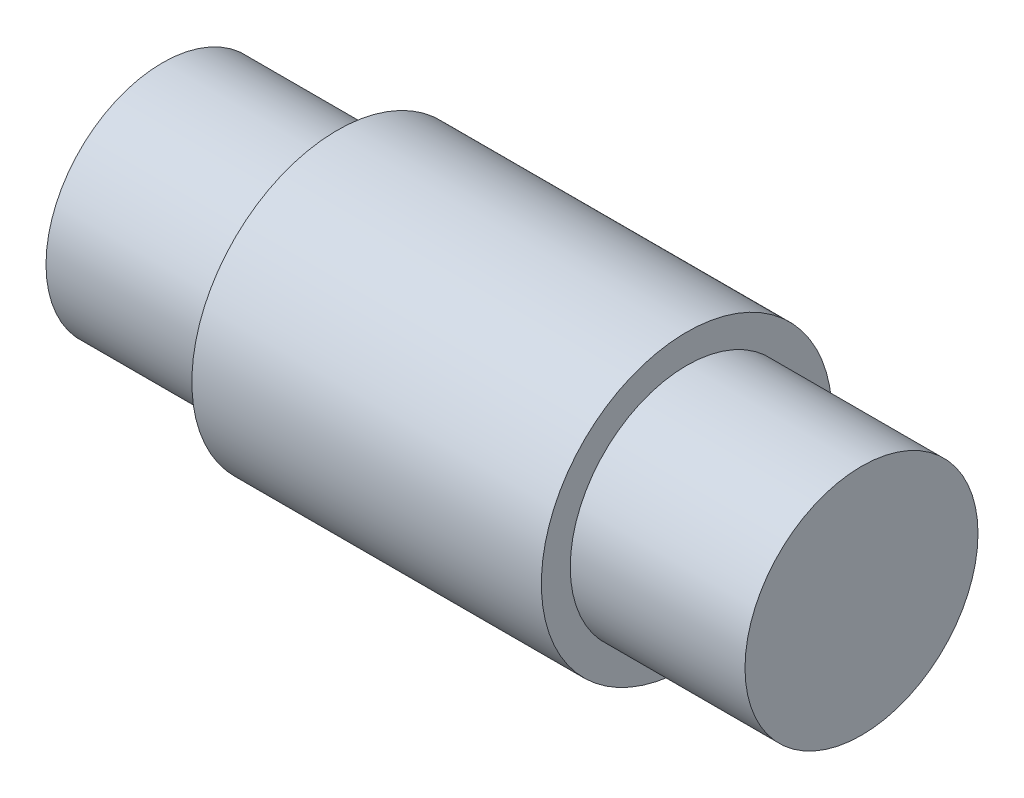
ISO-10303-21;
HEADER;
FILE_DESCRIPTION(('STEP AP214'),'2;1');
FILE_NAME('part.step','',(''),(''),'','','');
FILE_SCHEMA(('AUTOMOTIVE_DESIGN { 1 0 10303 214 1 1 1 1 }'));
ENDSEC;
DATA;
#1=APPLICATION_CONTEXT('core data for automotive mechanical design processes');
#2=APPLICATION_PROTOCOL_DEFINITION('international standard','automotive_design',2000,#1);
#3=PRODUCT_CONTEXT('',#1,'mechanical');
#4=PRODUCT('Part','Part','',(#3));
#5=PRODUCT_RELATED_PRODUCT_CATEGORY('part','',(#4));
#6=PRODUCT_DEFINITION_FORMATION('','',#4);
#7=PRODUCT_DEFINITION_CONTEXT('part definition',#1,'design');
#8=PRODUCT_DEFINITION('design','',#6,#7);
#9=PRODUCT_DEFINITION_SHAPE('','',#8);
#10=(LENGTH_UNIT() NAMED_UNIT(*) SI_UNIT(.MILLI.,.METRE.));
#11=(NAMED_UNIT(*) PLANE_ANGLE_UNIT() SI_UNIT($,.RADIAN.));
#12=(NAMED_UNIT(*) SI_UNIT($,.STERADIAN.) SOLID_ANGLE_UNIT());
#13=UNCERTAINTY_MEASURE_WITH_UNIT(LENGTH_MEASURE(1.E-05),#10,'distance_accuracy_value','');
#14=(GEOMETRIC_REPRESENTATION_CONTEXT(3) GLOBAL_UNCERTAINTY_ASSIGNED_CONTEXT((#13)) GLOBAL_UNIT_ASSIGNED_CONTEXT((#10,
#11,#12)) REPRESENTATION_CONTEXT('',''));
#15=CARTESIAN_POINT('',(0.,0.,0.));
#16=DIRECTION('',(0.,0.,1.));
#17=DIRECTION('',(1.,0.,0.));
#18=AXIS2_PLACEMENT_3D('',#15,#16,#17);
#19=CARTESIAN_POINT('',(9.525,0.,0.));
#20=DIRECTION('',(1.,0.,0.));
#21=DIRECTION('',(0.,0.,-1.));
#22=AXIS2_PLACEMENT_3D('',#19,#20,#21);
#23=PLANE('',#22);
#24=CARTESIAN_POINT('',(9.525,0.,0.));
#25=DIRECTION('',(1.,0.,0.));
#26=DIRECTION('',(0.,0.,-1.));
#27=AXIS2_PLACEMENT_3D('',#24,#25,#26);
#28=CIRCLE('',#27,3.175);
#29=CARTESIAN_POINT('',(9.525,0.,-3.175));
#30=VERTEX_POINT('',#29);
#31=EDGE_CURVE('E10',#30,#30,#28,.T.);
#32=ORIENTED_EDGE('',*,*,#31,.T.);
#33=EDGE_LOOP('',(#32));
#34=FACE_BOUND('',#33,.T.);
#35=ADVANCED_FACE('F36',(#34),#23,.T.);
#36=CARTESIAN_POINT('',(0.,0.,0.));
#37=DIRECTION('',(1.,0.,0.));
#38=DIRECTION('',(0.,0.,-1.));
#39=AXIS2_PLACEMENT_3D('',#36,#37,#38);
#40=CYLINDRICAL_SURFACE('',#39,3.175);
#41=ORIENTED_EDGE('',*,*,#31,.F.);
#42=EDGE_LOOP('',(#41));
#43=FACE_BOUND('',#42,.T.);
#44=CARTESIAN_POINT('',(4.7625,0.,0.));
#45=DIRECTION('',(1.,0.,0.));
#46=DIRECTION('',(0.,0.,-1.));
#47=AXIS2_PLACEMENT_3D('',#44,#45,#46);
#48=CIRCLE('',#47,3.175);
#49=CARTESIAN_POINT('',(4.7625,0.,-3.175));
#50=VERTEX_POINT('',#49);
#51=EDGE_CURVE('E42',#50,#50,#48,.T.);
#52=ORIENTED_EDGE('',*,*,#51,.T.);
#53=EDGE_LOOP('',(#52));
#54=FACE_BOUND('',#53,.T.);
#55=ADVANCED_FACE('F74',(#43,#54),#40,.T.);
#56=CARTESIAN_POINT('',(4.7625,0.,0.));
#57=DIRECTION('',(1.,0.,0.));
#58=DIRECTION('',(0.,0.,-1.));
#59=AXIS2_PLACEMENT_3D('',#56,#57,#58);
#60=PLANE('',#59);
#61=CARTESIAN_POINT('',(4.7625,0.,0.));
#62=DIRECTION('',(1.,0.,0.));
#63=DIRECTION('',(0.,0.,-1.));
#64=AXIS2_PLACEMENT_3D('',#61,#62,#63);
#65=CIRCLE('',#64,3.9624);
#66=CARTESIAN_POINT('',(4.7625,0.,-3.9624));
#67=VERTEX_POINT('',#66);
#68=EDGE_CURVE('E46',#67,#67,#65,.T.);
#69=ORIENTED_EDGE('',*,*,#68,.T.);
#70=EDGE_LOOP('',(#69));
#71=FACE_BOUND('',#70,.T.);
#72=ORIENTED_EDGE('',*,*,#51,.F.);
#73=EDGE_LOOP('',(#72));
#74=FACE_BOUND('',#73,.T.);
#75=ADVANCED_FACE('F78',(#71,#74),#60,.T.);
#76=CARTESIAN_POINT('',(0.,0.,0.));
#77=DIRECTION('',(1.,0.,0.));
#78=DIRECTION('',(0.,0.,-1.));
#79=AXIS2_PLACEMENT_3D('',#76,#77,#78);
#80=CYLINDRICAL_SURFACE('',#79,3.9624);
#81=ORIENTED_EDGE('',*,*,#68,.F.);
#82=EDGE_LOOP('',(#81));
#83=FACE_BOUND('',#82,.T.);
#84=CARTESIAN_POINT('',(-4.7625,0.,0.));
#85=DIRECTION('',(1.,0.,0.));
#86=DIRECTION('',(0.,0.,-1.));
#87=AXIS2_PLACEMENT_3D('',#84,#85,#86);
#88=CIRCLE('',#87,3.9624);
#89=CARTESIAN_POINT('',(-4.7625,0.,-3.9624));
#90=VERTEX_POINT('',#89);
#91=EDGE_CURVE('E50',#90,#90,#88,.T.);
#92=ORIENTED_EDGE('',*,*,#91,.T.);
#93=EDGE_LOOP('',(#92));
#94=FACE_BOUND('',#93,.T.);
#95=ADVANCED_FACE('F83',(#83,#94),#80,.T.);
#96=CARTESIAN_POINT('',(-4.7625,0.,0.));
#97=DIRECTION('',(1.,0.,0.));
#98=DIRECTION('',(0.,0.,-1.));
#99=AXIS2_PLACEMENT_3D('',#96,#97,#98);
#100=PLANE('',#99);
#101=ORIENTED_EDGE('',*,*,#91,.F.);
#102=EDGE_LOOP('',(#101));
#103=FACE_BOUND('',#102,.T.);
#104=CARTESIAN_POINT('',(-4.7625,0.,0.));
#105=DIRECTION('',(1.,0.,0.));
#106=DIRECTION('',(0.,0.,-1.));
#107=AXIS2_PLACEMENT_3D('',#104,#105,#106);
#108=CIRCLE('',#107,3.175);
#109=CARTESIAN_POINT('',(-4.7625,0.,-3.175));
#110=VERTEX_POINT('',#109);
#111=EDGE_CURVE('E55',#110,#110,#108,.T.);
#112=ORIENTED_EDGE('',*,*,#111,.T.);
#113=EDGE_LOOP('',(#112));
#114=FACE_BOUND('',#113,.T.);
#115=ADVANCED_FACE('F71',(#103,#114),#100,.F.);
#116=CARTESIAN_POINT('',(0.,0.,0.));
#117=DIRECTION('',(1.,0.,0.));
#118=DIRECTION('',(0.,0.,-1.));
#119=AXIS2_PLACEMENT_3D('',#116,#117,#118);
#120=CYLINDRICAL_SURFACE('',#119,3.175);
#121=CARTESIAN_POINT('',(-9.525,0.,0.));
#122=DIRECTION('',(1.,0.,0.));
#123=DIRECTION('',(0.,0.,-1.));
#124=AXIS2_PLACEMENT_3D('',#121,#122,#123);
#125=CIRCLE('',#124,3.175);
#126=CARTESIAN_POINT('',(-9.525,0.,-3.175));
#127=VERTEX_POINT('',#126);
#128=EDGE_CURVE('E58',#127,#127,#125,.T.);
#129=ORIENTED_EDGE('',*,*,#128,.T.);
#130=EDGE_LOOP('',(#129));
#131=FACE_BOUND('',#130,.T.);
#132=ORIENTED_EDGE('',*,*,#111,.F.);
#133=EDGE_LOOP('',(#132));
#134=FACE_BOUND('',#133,.T.);
#135=ADVANCED_FACE('F62',(#131,#134),#120,.T.);
#136=CARTESIAN_POINT('',(-9.525,0.,0.));
#137=DIRECTION('',(1.,0.,0.));
#138=DIRECTION('',(0.,0.,-1.));
#139=AXIS2_PLACEMENT_3D('',#136,#137,#138);
#140=PLANE('',#139);
#141=ORIENTED_EDGE('',*,*,#128,.F.);
#142=EDGE_LOOP('',(#141));
#143=FACE_BOUND('',#142,.T.);
#144=ADVANCED_FACE('F65',(#143),#140,.F.);
#145=CLOSED_SHELL('',(#35,#55,#75,#95,#115,#135,#144));
#146=MANIFOLD_SOLID_BREP('B2',#145);
#147=ADVANCED_BREP_SHAPE_REPRESENTATION('',(#18,#146),#14);
#148=SHAPE_DEFINITION_REPRESENTATION(#9,#147);
ENDSEC;
END-ISO-10303-21;
